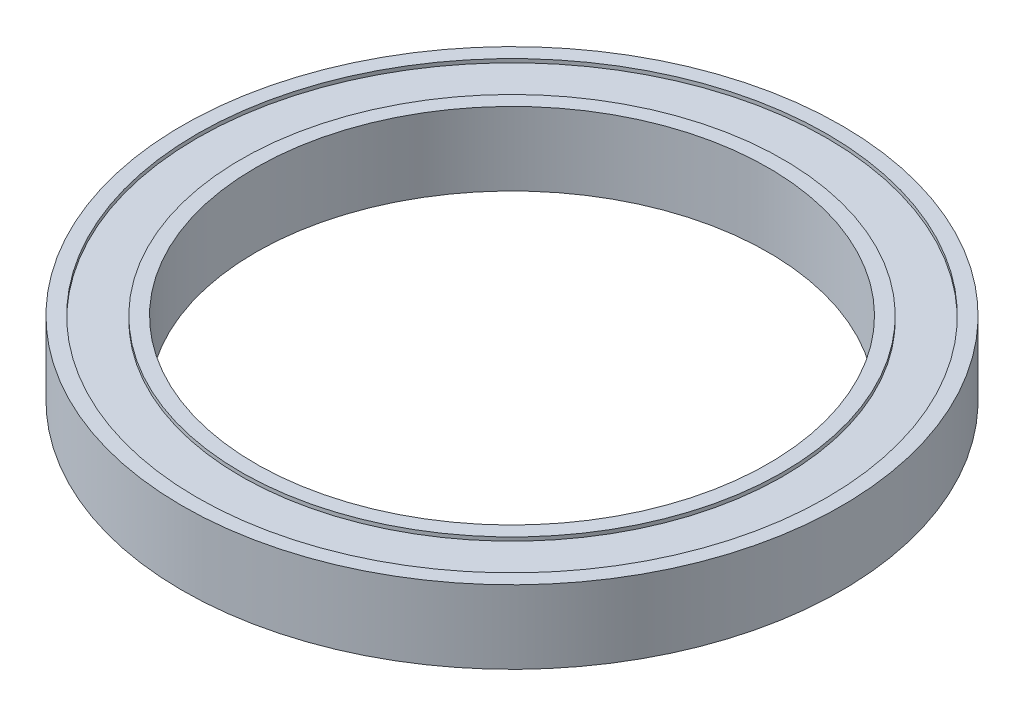
ISO-10303-21;
HEADER;
FILE_DESCRIPTION(('STEP AP214'),'2;1');
FILE_NAME('part.step','',(''),(''),'','','');
FILE_SCHEMA(('AUTOMOTIVE_DESIGN { 1 0 10303 214 1 1 1 1 }'));
ENDSEC;
DATA;
#1=APPLICATION_CONTEXT('core data for automotive mechanical design processes');
#2=APPLICATION_PROTOCOL_DEFINITION('international standard','automotive_design',2000,#1);
#3=PRODUCT_CONTEXT('',#1,'mechanical');
#4=PRODUCT('Part','Part','',(#3));
#5=PRODUCT_RELATED_PRODUCT_CATEGORY('part','',(#4));
#6=PRODUCT_DEFINITION_FORMATION('','',#4);
#7=PRODUCT_DEFINITION_CONTEXT('part definition',#1,'design');
#8=PRODUCT_DEFINITION('design','',#6,#7);
#9=PRODUCT_DEFINITION_SHAPE('','',#8);
#10=(LENGTH_UNIT() NAMED_UNIT(*) SI_UNIT(.MILLI.,.METRE.));
#11=(NAMED_UNIT(*) PLANE_ANGLE_UNIT() SI_UNIT($,.RADIAN.));
#12=(NAMED_UNIT(*) SI_UNIT($,.STERADIAN.) SOLID_ANGLE_UNIT());
#13=UNCERTAINTY_MEASURE_WITH_UNIT(LENGTH_MEASURE(1.E-05),#10,'distance_accuracy_value','');
#14=(GEOMETRIC_REPRESENTATION_CONTEXT(3) GLOBAL_UNCERTAINTY_ASSIGNED_CONTEXT((#13)) GLOBAL_UNIT_ASSIGNED_CONTEXT((#10,
#11,#12)) REPRESENTATION_CONTEXT('',''));
#15=CARTESIAN_POINT('',(0.,0.,0.));
#16=DIRECTION('',(0.,0.,1.));
#17=DIRECTION('',(1.,0.,0.));
#18=AXIS2_PLACEMENT_3D('',#15,#16,#17);
#19=CARTESIAN_POINT('',(-5.90811626948565,-1.00000000000001,42.5921842847516));
#20=DIRECTION('',(0.,1.,0.));
#21=DIRECTION('',(-0.137398052778736,0.,0.990515913598874));
#22=AXIS2_PLACEMENT_3D('',#19,#20,#21);
#23=PLANE('',#22);
#24=CARTESIAN_POINT('',(0.,-1.00000000000001,0.));
#25=DIRECTION('',(0.,1.,0.));
#26=DIRECTION('',(-0.137398052778736,0.,0.990515913598874));
#27=AXIS2_PLACEMENT_3D('',#24,#25,#26);
#28=CIRCLE('',#27,45.);
#29=CARTESIAN_POINT('',(-6.18291237504312,-1.00000000000001,44.5732161119493));
#30=VERTEX_POINT('',#29);
#31=EDGE_CURVE('E11',#30,#30,#28,.T.);
#32=ORIENTED_EDGE('',*,*,#31,.T.);
#33=EDGE_LOOP('',(#32));
#34=FACE_BOUND('',#33,.T.);
#35=CARTESIAN_POINT('',(0.,-1.00000000000001,0.));
#36=DIRECTION('',(0.,1.,0.));
#37=DIRECTION('',(-0.137398052778736,0.,0.990515913598874));
#38=AXIS2_PLACEMENT_3D('',#35,#36,#37);
#39=CIRCLE('',#38,43.);
#40=CARTESIAN_POINT('',(-5.90811626948565,-1.00000000000001,42.5921842847516));
#41=VERTEX_POINT('',#40);
#42=EDGE_CURVE('E139',#41,#41,#39,.T.);
#43=ORIENTED_EDGE('',*,*,#42,.F.);
#44=EDGE_LOOP('',(#43));
#45=FACE_BOUND('',#44,.T.);
#46=ADVANCED_FACE('F46',(#34,#45),#23,.T.);
#47=CARTESIAN_POINT('',(0.,-6.00000000000001,0.));
#48=DIRECTION('',(0.,1.,0.));
#49=DIRECTION('',(-0.137398052778736,0.,0.990515913598874));
#50=AXIS2_PLACEMENT_3D('',#47,#48,#49);
#51=CYLINDRICAL_SURFACE('',#50,45.);
#52=CARTESIAN_POINT('',(0.,-11.,0.));
#53=DIRECTION('',(0.,1.,0.));
#54=DIRECTION('',(-0.137398052778736,0.,0.990515913598874));
#55=AXIS2_PLACEMENT_3D('',#52,#53,#54);
#56=CIRCLE('',#55,45.);
#57=CARTESIAN_POINT('',(-6.18291237504312,-11.,44.5732161119493));
#58=VERTEX_POINT('',#57);
#59=EDGE_CURVE('E57',#58,#58,#56,.T.);
#60=ORIENTED_EDGE('',*,*,#59,.T.);
#61=EDGE_LOOP('',(#60));
#62=FACE_BOUND('',#61,.T.);
#63=ORIENTED_EDGE('',*,*,#31,.F.);
#64=EDGE_LOOP('',(#63));
#65=FACE_BOUND('',#64,.T.);
#66=ADVANCED_FACE('F187',(#62,#65),#51,.T.);
#67=CARTESIAN_POINT('',(-6.18291237504312,-11.,44.5732161119493));
#68=DIRECTION('',(0.,-1.,0.));
#69=DIRECTION('',(0.990515913598874,0.,0.137398052778736));
#70=AXIS2_PLACEMENT_3D('',#67,#68,#69);
#71=PLANE('',#70);
#72=CARTESIAN_POINT('',(0.,-11.,0.));
#73=DIRECTION('',(0.,1.,0.));
#74=DIRECTION('',(-0.137398052778736,0.,0.990515913598874));
#75=AXIS2_PLACEMENT_3D('',#72,#73,#74);
#76=CIRCLE('',#75,43.);
#77=CARTESIAN_POINT('',(-5.90811626948565,-11.,42.5921842847516));
#78=VERTEX_POINT('',#77);
#79=EDGE_CURVE('E98',#78,#78,#76,.T.);
#80=ORIENTED_EDGE('',*,*,#79,.T.);
#81=EDGE_LOOP('',(#80));
#82=FACE_BOUND('',#81,.T.);
#83=ORIENTED_EDGE('',*,*,#59,.F.);
#84=EDGE_LOOP('',(#83));
#85=FACE_BOUND('',#84,.T.);
#86=ADVANCED_FACE('F193',(#82,#85),#71,.T.);
#87=CARTESIAN_POINT('',(0.,-6.00000000000001,0.));
#88=DIRECTION('',(0.,1.,0.));
#89=DIRECTION('',(-0.137398052778736,0.,0.990515913598874));
#90=AXIS2_PLACEMENT_3D('',#87,#88,#89);
#91=CYLINDRICAL_SURFACE('',#90,43.);
#92=CARTESIAN_POINT('',(0.,-10.5,0.));
#93=DIRECTION('',(0.,1.,0.));
#94=DIRECTION('',(-0.137398052778736,0.,0.990515913598874));
#95=AXIS2_PLACEMENT_3D('',#92,#93,#94);
#96=CIRCLE('',#95,43.);
#97=CARTESIAN_POINT('',(-5.90811626948565,-10.5,42.5921842847516));
#98=VERTEX_POINT('',#97);
#99=EDGE_CURVE('E109',#98,#98,#96,.T.);
#100=ORIENTED_EDGE('',*,*,#99,.T.);
#101=EDGE_LOOP('',(#100));
#102=FACE_BOUND('',#101,.T.);
#103=ORIENTED_EDGE('',*,*,#79,.F.);
#104=EDGE_LOOP('',(#103));
#105=FACE_BOUND('',#104,.T.);
#106=ADVANCED_FACE('F198',(#102,#105),#91,.F.);
#107=CARTESIAN_POINT('',(-5.90811626948565,-10.5,42.5921842847516));
#108=DIRECTION('',(0.,-1.,0.));
#109=DIRECTION('',(0.990515913598874,0.,0.137398052778736));
#110=AXIS2_PLACEMENT_3D('',#107,#108,#109);
#111=PLANE('',#110);
#112=CARTESIAN_POINT('',(0.,-10.5,0.));
#113=DIRECTION('',(0.,1.,0.));
#114=DIRECTION('',(-0.137398052778736,0.,0.990515913598874));
#115=AXIS2_PLACEMENT_3D('',#112,#113,#114);
#116=CIRCLE('',#115,37.);
#117=CARTESIAN_POINT('',(-5.08372795281323,-10.5,36.6490888031583));
#118=VERTEX_POINT('',#117);
#119=EDGE_CURVE('E123',#118,#118,#116,.T.);
#120=ORIENTED_EDGE('',*,*,#119,.T.);
#121=EDGE_LOOP('',(#120));
#122=FACE_BOUND('',#121,.T.);
#123=ORIENTED_EDGE('',*,*,#99,.F.);
#124=EDGE_LOOP('',(#123));
#125=FACE_BOUND('',#124,.T.);
#126=ADVANCED_FACE('F202',(#122,#125),#111,.T.);
#127=CARTESIAN_POINT('',(0.,-6.00000000000001,0.));
#128=DIRECTION('',(0.,1.,0.));
#129=DIRECTION('',(-0.137398052778736,0.,0.990515913598874));
#130=AXIS2_PLACEMENT_3D('',#127,#128,#129);
#131=CYLINDRICAL_SURFACE('',#130,37.);
#132=CARTESIAN_POINT('',(0.,-11.,0.));
#133=DIRECTION('',(0.,1.,0.));
#134=DIRECTION('',(-0.137398052778736,0.,0.990515913598874));
#135=AXIS2_PLACEMENT_3D('',#132,#133,#134);
#136=CIRCLE('',#135,37.);
#137=CARTESIAN_POINT('',(-5.08372795281323,-11.,36.6490888031583));
#138=VERTEX_POINT('',#137);
#139=EDGE_CURVE('E119',#138,#138,#136,.T.);
#140=ORIENTED_EDGE('',*,*,#139,.T.);
#141=EDGE_LOOP('',(#140));
#142=FACE_BOUND('',#141,.T.);
#143=ORIENTED_EDGE('',*,*,#119,.F.);
#144=EDGE_LOOP('',(#143));
#145=FACE_BOUND('',#144,.T.);
#146=ADVANCED_FACE('F199',(#142,#145),#131,.T.);
#147=CARTESIAN_POINT('',(-5.08372795281323,-11.,36.6490888031583));
#148=DIRECTION('',(0.,-1.,0.));
#149=DIRECTION('',(0.990515913598874,0.,0.137398052778736));
#150=AXIS2_PLACEMENT_3D('',#147,#148,#149);
#151=PLANE('',#150);
#152=CARTESIAN_POINT('',(0.,-11.,0.));
#153=DIRECTION('',(0.,1.,0.));
#154=DIRECTION('',(-0.137398052778736,0.,0.990515913598874));
#155=AXIS2_PLACEMENT_3D('',#152,#153,#154);
#156=CIRCLE('',#155,35.);
#157=CARTESIAN_POINT('',(-4.80893184725576,-11.,34.6680569759606));
#158=VERTEX_POINT('',#157);
#159=EDGE_CURVE('E114',#158,#158,#156,.T.);
#160=ORIENTED_EDGE('',*,*,#159,.T.);
#161=EDGE_LOOP('',(#160));
#162=FACE_BOUND('',#161,.T.);
#163=ORIENTED_EDGE('',*,*,#139,.F.);
#164=EDGE_LOOP('',(#163));
#165=FACE_BOUND('',#164,.T.);
#166=ADVANCED_FACE('F120',(#162,#165),#151,.T.);
#167=CARTESIAN_POINT('',(0.,-6.00000000000001,0.));
#168=DIRECTION('',(0.,1.,0.));
#169=DIRECTION('',(-0.137398052778736,0.,0.990515913598874));
#170=AXIS2_PLACEMENT_3D('',#167,#168,#169);
#171=CYLINDRICAL_SURFACE('',#170,35.);
#172=CARTESIAN_POINT('',(0.,-1.00000000000001,0.));
#173=DIRECTION('',(0.,1.,0.));
#174=DIRECTION('',(-0.137398052778736,0.,0.990515913598874));
#175=AXIS2_PLACEMENT_3D('',#172,#173,#174);
#176=CIRCLE('',#175,35.);
#177=CARTESIAN_POINT('',(-4.80893184725576,-1.00000000000001,34.6680569759606));
#178=VERTEX_POINT('',#177);
#179=EDGE_CURVE('E132',#178,#178,#176,.T.);
#180=ORIENTED_EDGE('',*,*,#179,.T.);
#181=EDGE_LOOP('',(#180));
#182=FACE_BOUND('',#181,.T.);
#183=ORIENTED_EDGE('',*,*,#159,.F.);
#184=EDGE_LOOP('',(#183));
#185=FACE_BOUND('',#184,.T.);
#186=ADVANCED_FACE('F184',(#182,#185),#171,.F.);
#187=CARTESIAN_POINT('',(-4.80893184725576,-1.00000000000001,34.6680569759606));
#188=DIRECTION('',(0.,1.,0.));
#189=DIRECTION('',(-0.137398052778736,0.,0.990515913598874));
#190=AXIS2_PLACEMENT_3D('',#187,#188,#189);
#191=PLANE('',#190);
#192=CARTESIAN_POINT('',(0.,-1.00000000000001,0.));
#193=DIRECTION('',(0.,1.,0.));
#194=DIRECTION('',(-0.137398052778736,0.,0.990515913598874));
#195=AXIS2_PLACEMENT_3D('',#192,#193,#194);
#196=CIRCLE('',#195,37.);
#197=CARTESIAN_POINT('',(-5.08372795281323,-1.00000000000001,36.6490888031583));
#198=VERTEX_POINT('',#197);
#199=EDGE_CURVE('E147',#198,#198,#196,.T.);
#200=ORIENTED_EDGE('',*,*,#199,.T.);
#201=EDGE_LOOP('',(#200));
#202=FACE_BOUND('',#201,.T.);
#203=ORIENTED_EDGE('',*,*,#179,.F.);
#204=EDGE_LOOP('',(#203));
#205=FACE_BOUND('',#204,.T.);
#206=ADVANCED_FACE('F48',(#202,#205),#191,.T.);
#207=CARTESIAN_POINT('',(0.,-6.00000000000001,0.));
#208=DIRECTION('',(0.,1.,0.));
#209=DIRECTION('',(-0.137398052778736,0.,0.990515913598874));
#210=AXIS2_PLACEMENT_3D('',#207,#208,#209);
#211=CYLINDRICAL_SURFACE('',#210,37.);
#212=CARTESIAN_POINT('',(0.,-1.50000000000001,0.));
#213=DIRECTION('',(0.,1.,0.));
#214=DIRECTION('',(-0.137398052778736,0.,0.990515913598874));
#215=AXIS2_PLACEMENT_3D('',#212,#213,#214);
#216=CIRCLE('',#215,37.);
#217=CARTESIAN_POINT('',(-5.08372795281323,-1.50000000000001,36.6490888031583));
#218=VERTEX_POINT('',#217);
#219=EDGE_CURVE('E50',#218,#218,#216,.T.);
#220=ORIENTED_EDGE('',*,*,#219,.T.);
#221=EDGE_LOOP('',(#220));
#222=FACE_BOUND('',#221,.T.);
#223=ORIENTED_EDGE('',*,*,#199,.F.);
#224=EDGE_LOOP('',(#223));
#225=FACE_BOUND('',#224,.T.);
#226=ADVANCED_FACE('F173',(#222,#225),#211,.T.);
#227=CARTESIAN_POINT('',(-5.08372795281323,-1.50000000000001,36.6490888031583));
#228=DIRECTION('',(0.,1.,0.));
#229=DIRECTION('',(-0.137398052778736,0.,0.990515913598874));
#230=AXIS2_PLACEMENT_3D('',#227,#228,#229);
#231=PLANE('',#230);
#232=CARTESIAN_POINT('',(0.,-1.50000000000001,0.));
#233=DIRECTION('',(0.,1.,0.));
#234=DIRECTION('',(-0.137398052778736,0.,0.990515913598874));
#235=AXIS2_PLACEMENT_3D('',#232,#233,#234);
#236=CIRCLE('',#235,43.);
#237=CARTESIAN_POINT('',(-5.90811626948565,-1.50000000000001,42.5921842847516));
#238=VERTEX_POINT('',#237);
#239=EDGE_CURVE('E136',#238,#238,#236,.T.);
#240=ORIENTED_EDGE('',*,*,#239,.T.);
#241=EDGE_LOOP('',(#240));
#242=FACE_BOUND('',#241,.T.);
#243=ORIENTED_EDGE('',*,*,#219,.F.);
#244=EDGE_LOOP('',(#243));
#245=FACE_BOUND('',#244,.T.);
#246=ADVANCED_FACE('F175',(#242,#245),#231,.T.);
#247=CARTESIAN_POINT('',(0.,-6.00000000000001,0.));
#248=DIRECTION('',(0.,1.,0.));
#249=DIRECTION('',(-0.137398052778736,0.,0.990515913598874));
#250=AXIS2_PLACEMENT_3D('',#247,#248,#249);
#251=CYLINDRICAL_SURFACE('',#250,43.);
#252=ORIENTED_EDGE('',*,*,#42,.T.);
#253=EDGE_LOOP('',(#252));
#254=FACE_BOUND('',#253,.T.);
#255=ORIENTED_EDGE('',*,*,#239,.F.);
#256=EDGE_LOOP('',(#255));
#257=FACE_BOUND('',#256,.T.);
#258=ADVANCED_FACE('F182',(#254,#257),#251,.F.);
#259=CLOSED_SHELL('',(#46,#66,#86,#106,#126,#146,#166,#186,#206,#226,#246,#258));
#260=MANIFOLD_SOLID_BREP('B2',#259);
#261=ADVANCED_BREP_SHAPE_REPRESENTATION('',(#18,#260),#14);
#262=SHAPE_DEFINITION_REPRESENTATION(#9,#261);
ENDSEC;
END-ISO-10303-21;
